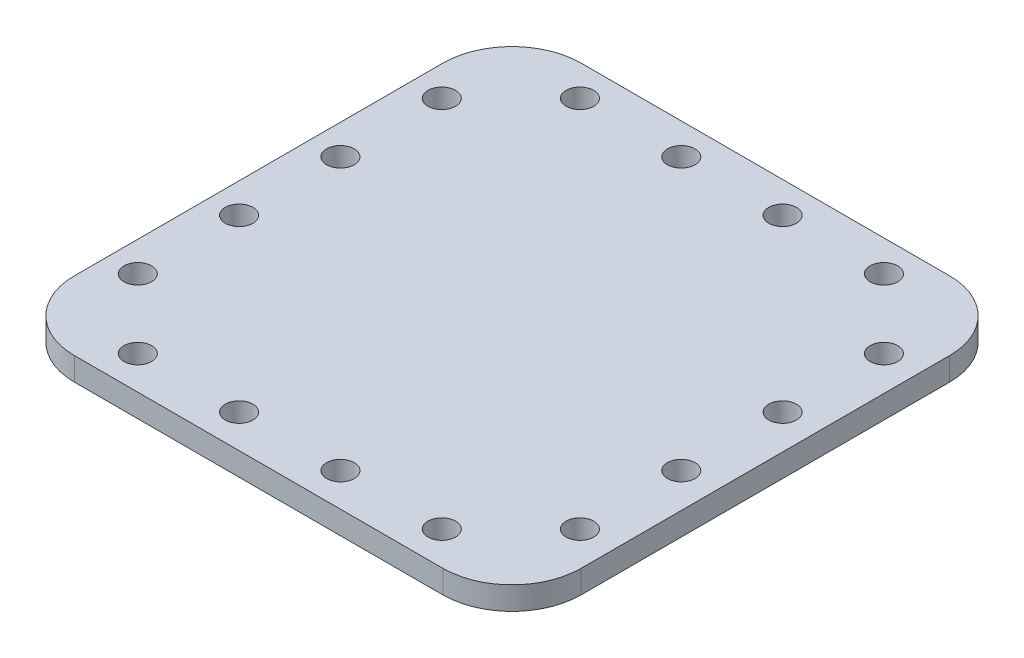
ISO-10303-21;
HEADER;
FILE_DESCRIPTION(('STEP AP214'),'2;1');
FILE_NAME('part.step','',(''),(''),'','','');
FILE_SCHEMA(('AUTOMOTIVE_DESIGN { 1 0 10303 214 1 1 1 1 }'));
ENDSEC;
DATA;
#1=APPLICATION_CONTEXT('core data for automotive mechanical design processes');
#2=APPLICATION_PROTOCOL_DEFINITION('international standard','automotive_design',2000,#1);
#3=PRODUCT_CONTEXT('',#1,'mechanical');
#4=PRODUCT('Part','Part','',(#3));
#5=PRODUCT_RELATED_PRODUCT_CATEGORY('part','',(#4));
#6=PRODUCT_DEFINITION_FORMATION('','',#4);
#7=PRODUCT_DEFINITION_CONTEXT('part definition',#1,'design');
#8=PRODUCT_DEFINITION('design','',#6,#7);
#9=PRODUCT_DEFINITION_SHAPE('','',#8);
#10=(LENGTH_UNIT() NAMED_UNIT(*) SI_UNIT(.MILLI.,.METRE.));
#11=(NAMED_UNIT(*) PLANE_ANGLE_UNIT() SI_UNIT($,.RADIAN.));
#12=(NAMED_UNIT(*) SI_UNIT($,.STERADIAN.) SOLID_ANGLE_UNIT());
#13=UNCERTAINTY_MEASURE_WITH_UNIT(LENGTH_MEASURE(1.E-05),#10,'distance_accuracy_value','');
#14=(GEOMETRIC_REPRESENTATION_CONTEXT(3) GLOBAL_UNCERTAINTY_ASSIGNED_CONTEXT((#13)) GLOBAL_UNIT_ASSIGNED_CONTEXT((#10,
#11,#12)) REPRESENTATION_CONTEXT('',''));
#15=CARTESIAN_POINT('',(0.,0.,0.));
#16=DIRECTION('',(0.,0.,1.));
#17=DIRECTION('',(1.,0.,0.));
#18=AXIS2_PLACEMENT_3D('',#15,#16,#17);
#19=CARTESIAN_POINT('',(40.,5.,55.));
#20=DIRECTION('',(0.,1.,0.));
#21=DIRECTION('',(0.,0.,1.));
#22=AXIS2_PLACEMENT_3D('',#19,#20,#21);
#23=PLANE('',#22);
#24=CARTESIAN_POINT('',(-48.5020444583901,5.,32.748977770805));
#25=DIRECTION('',(0.,-1.,0.));
#26=DIRECTION('',(0.,0.,-1.));
#27=AXIS2_PLACEMENT_3D('',#24,#25,#26);
#28=CIRCLE('',#27,3.);
#29=CARTESIAN_POINT('',(-48.5020444583901,5.,29.7489777708049));
#30=VERTEX_POINT('',#29);
#31=EDGE_CURVE('E133',#30,#30,#28,.T.);
#32=ORIENTED_EDGE('',*,*,#31,.T.);
#33=EDGE_LOOP('',(#32));
#34=FACE_BOUND('',#33,.T.);
#35=CARTESIAN_POINT('',(-11.5020444583901,5.,-48.2510222291951));
#36=DIRECTION('',(0.,-1.,0.));
#37=DIRECTION('',(0.,0.,-1.));
#38=AXIS2_PLACEMENT_3D('',#35,#36,#37);
#39=CIRCLE('',#38,3.00000000000002);
#40=CARTESIAN_POINT('',(-11.5020444583901,5.,-51.2510222291951));
#41=VERTEX_POINT('',#40);
#42=EDGE_CURVE('E136',#41,#41,#39,.T.);
#43=ORIENTED_EDGE('',*,*,#42,.T.);
#44=EDGE_LOOP('',(#43));
#45=FACE_BOUND('',#44,.T.);
#46=CARTESIAN_POINT('',(10.4979555416099,5.,-48.2510222291951));
#47=DIRECTION('',(0.,-1.,0.));
#48=DIRECTION('',(0.,0.,-1.));
#49=AXIS2_PLACEMENT_3D('',#46,#47,#48);
#50=CIRCLE('',#49,2.99999999999997);
#51=CARTESIAN_POINT('',(10.4979555416099,5.,-51.251022229195));
#52=VERTEX_POINT('',#51);
#53=EDGE_CURVE('E139',#52,#52,#50,.T.);
#54=ORIENTED_EDGE('',*,*,#53,.T.);
#55=EDGE_LOOP('',(#54));
#56=FACE_BOUND('',#55,.T.);
#57=CARTESIAN_POINT('',(47.4979555416099,5.,-11.251022229195));
#58=DIRECTION('',(0.,-1.,0.));
#59=DIRECTION('',(0.,0.,-1.));
#60=AXIS2_PLACEMENT_3D('',#57,#58,#59);
#61=CIRCLE('',#60,3.00000000000002);
#62=CARTESIAN_POINT('',(47.4979555416099,5.,-14.2510222291951));
#63=VERTEX_POINT('',#62);
#64=EDGE_CURVE('E142',#63,#63,#61,.T.);
#65=ORIENTED_EDGE('',*,*,#64,.T.);
#66=EDGE_LOOP('',(#65));
#67=FACE_BOUND('',#66,.T.);
#68=CARTESIAN_POINT('',(47.4979555416099,5.,32.748977770805));
#69=DIRECTION('',(0.,-1.,0.));
#70=DIRECTION('',(0.,0.,-1.));
#71=AXIS2_PLACEMENT_3D('',#68,#69,#70);
#72=CIRCLE('',#71,3.00000000000001);
#73=CARTESIAN_POINT('',(47.4979555416099,5.,29.7489777708049));
#74=VERTEX_POINT('',#73);
#75=EDGE_CURVE('E145',#74,#74,#72,.T.);
#76=ORIENTED_EDGE('',*,*,#75,.T.);
#77=EDGE_LOOP('',(#76));
#78=FACE_BOUND('',#77,.T.);
#79=CARTESIAN_POINT('',(-48.5020444583901,5.,10.7489777708049));
#80=DIRECTION('',(0.,-1.,0.));
#81=DIRECTION('',(0.,0.,-1.));
#82=AXIS2_PLACEMENT_3D('',#79,#80,#81);
#83=CIRCLE('',#82,2.99999999999997);
#84=CARTESIAN_POINT('',(-48.5020444583901,5.,7.74897777080498));
#85=VERTEX_POINT('',#84);
#86=EDGE_CURVE('E148',#85,#85,#83,.T.);
#87=ORIENTED_EDGE('',*,*,#86,.T.);
#88=EDGE_LOOP('',(#87));
#89=FACE_BOUND('',#88,.T.);
#90=CARTESIAN_POINT('',(-48.5020444583901,5.,-11.2510222291951));
#91=DIRECTION('',(0.,-1.,0.));
#92=DIRECTION('',(0.,0.,-1.));
#93=AXIS2_PLACEMENT_3D('',#90,#91,#92);
#94=CIRCLE('',#93,3.00000000000003);
#95=CARTESIAN_POINT('',(-48.5020444583901,5.,-14.2510222291951));
#96=VERTEX_POINT('',#95);
#97=EDGE_CURVE('E151',#96,#96,#94,.T.);
#98=ORIENTED_EDGE('',*,*,#97,.T.);
#99=EDGE_LOOP('',(#98));
#100=FACE_BOUND('',#99,.T.);
#101=CARTESIAN_POINT('',(-48.5020444583901,5.,-33.2510222291951));
#102=DIRECTION('',(0.,-1.,0.));
#103=DIRECTION('',(0.,0.,-1.));
#104=AXIS2_PLACEMENT_3D('',#101,#102,#103);
#105=CIRCLE('',#104,3.);
#106=CARTESIAN_POINT('',(-48.5020444583901,5.,-36.2510222291951));
#107=VERTEX_POINT('',#106);
#108=EDGE_CURVE('E154',#107,#107,#105,.T.);
#109=ORIENTED_EDGE('',*,*,#108,.T.);
#110=EDGE_LOOP('',(#109));
#111=FACE_BOUND('',#110,.T.);
#112=CARTESIAN_POINT('',(-33.5020444583901,5.,47.748977770805));
#113=DIRECTION('',(0.,-1.,0.));
#114=DIRECTION('',(0.,0.,-1.));
#115=AXIS2_PLACEMENT_3D('',#112,#113,#114);
#116=CIRCLE('',#115,3.00000000000001);
#117=CARTESIAN_POINT('',(-33.5020444583901,5.,44.7489777708049));
#118=VERTEX_POINT('',#117);
#119=EDGE_CURVE('E157',#118,#118,#116,.T.);
#120=ORIENTED_EDGE('',*,*,#119,.T.);
#121=EDGE_LOOP('',(#120));
#122=FACE_BOUND('',#121,.T.);
#123=CARTESIAN_POINT('',(-11.5020444583901,5.,47.7489777708049));
#124=DIRECTION('',(0.,-1.,0.));
#125=DIRECTION('',(0.,0.,-1.));
#126=AXIS2_PLACEMENT_3D('',#123,#124,#125);
#127=CIRCLE('',#126,3.00000000000002);
#128=CARTESIAN_POINT('',(-11.5020444583901,5.,44.7489777708049));
#129=VERTEX_POINT('',#128);
#130=EDGE_CURVE('E160',#129,#129,#127,.T.);
#131=ORIENTED_EDGE('',*,*,#130,.T.);
#132=EDGE_LOOP('',(#131));
#133=FACE_BOUND('',#132,.T.);
#134=CARTESIAN_POINT('',(10.4979555416099,5.,47.7489777708049));
#135=DIRECTION('',(0.,-1.,0.));
#136=DIRECTION('',(0.,0.,-1.));
#137=AXIS2_PLACEMENT_3D('',#134,#135,#136);
#138=CIRCLE('',#137,2.99999999999997);
#139=CARTESIAN_POINT('',(10.4979555416099,5.,44.748977770805));
#140=VERTEX_POINT('',#139);
#141=EDGE_CURVE('E163',#140,#140,#138,.T.);
#142=ORIENTED_EDGE('',*,*,#141,.T.);
#143=EDGE_LOOP('',(#142));
#144=FACE_BOUND('',#143,.T.);
#145=CARTESIAN_POINT('',(32.4979555416099,5.,47.7489777708049));
#146=DIRECTION('',(0.,-1.,0.));
#147=DIRECTION('',(0.,0.,-1.));
#148=AXIS2_PLACEMENT_3D('',#145,#146,#147);
#149=CIRCLE('',#148,3.00000000000001);
#150=CARTESIAN_POINT('',(32.4979555416099,5.,44.7489777708049));
#151=VERTEX_POINT('',#150);
#152=EDGE_CURVE('E166',#151,#151,#149,.T.);
#153=ORIENTED_EDGE('',*,*,#152,.T.);
#154=EDGE_LOOP('',(#153));
#155=FACE_BOUND('',#154,.T.);
#156=CARTESIAN_POINT('',(47.4979555416099,5.,10.7489777708049));
#157=DIRECTION('',(0.,-1.,0.));
#158=DIRECTION('',(0.,0.,-1.));
#159=AXIS2_PLACEMENT_3D('',#156,#157,#158);
#160=CIRCLE('',#159,2.99999999999997);
#161=CARTESIAN_POINT('',(47.4979555416099,5.,7.74897777080498));
#162=VERTEX_POINT('',#161);
#163=EDGE_CURVE('E169',#162,#162,#160,.T.);
#164=ORIENTED_EDGE('',*,*,#163,.T.);
#165=EDGE_LOOP('',(#164));
#166=FACE_BOUND('',#165,.T.);
#167=CARTESIAN_POINT('',(47.4979555416099,5.,-33.2510222291951));
#168=DIRECTION('',(0.,-1.,0.));
#169=DIRECTION('',(0.,0.,-1.));
#170=AXIS2_PLACEMENT_3D('',#167,#168,#169);
#171=CIRCLE('',#170,3.00000000000001);
#172=CARTESIAN_POINT('',(47.4979555416099,5.,-36.2510222291951));
#173=VERTEX_POINT('',#172);
#174=EDGE_CURVE('E172',#173,#173,#171,.T.);
#175=ORIENTED_EDGE('',*,*,#174,.T.);
#176=EDGE_LOOP('',(#175));
#177=FACE_BOUND('',#176,.T.);
#178=CARTESIAN_POINT('',(32.4979555416099,5.,-48.2510222291951));
#179=DIRECTION('',(0.,-1.,0.));
#180=DIRECTION('',(0.,0.,-1.));
#181=AXIS2_PLACEMENT_3D('',#178,#179,#180);
#182=CIRCLE('',#181,2.99999999999997);
#183=CARTESIAN_POINT('',(32.4979555416099,5.,-51.251022229195));
#184=VERTEX_POINT('',#183);
#185=EDGE_CURVE('E175',#184,#184,#182,.T.);
#186=ORIENTED_EDGE('',*,*,#185,.T.);
#187=EDGE_LOOP('',(#186));
#188=FACE_BOUND('',#187,.T.);
#189=CARTESIAN_POINT('',(-33.5020444583901,5.,-48.2510222291951));
#190=DIRECTION('',(0.,-1.,0.));
#191=DIRECTION('',(0.,0.,-1.));
#192=AXIS2_PLACEMENT_3D('',#189,#190,#191);
#193=CIRCLE('',#192,3.00000000000001);
#194=CARTESIAN_POINT('',(-33.5020444583901,5.,-51.2510222291951));
#195=VERTEX_POINT('',#194);
#196=EDGE_CURVE('E178',#195,#195,#193,.T.);
#197=ORIENTED_EDGE('',*,*,#196,.T.);
#198=EDGE_LOOP('',(#197));
#199=FACE_BOUND('',#198,.T.);
#200=DIRECTION('',(1.,0.,0.));
#201=VECTOR('',#200,1.);
#202=CARTESIAN_POINT('',(-55.,5.,55.));
#203=LINE('',#202,#201);
#204=CARTESIAN_POINT('',(-40.,5.,55.));
#205=VERTEX_POINT('',#204);
#206=CARTESIAN_POINT('',(40.,5.,55.));
#207=VERTEX_POINT('',#206);
#208=EDGE_CURVE('E109',#205,#207,#203,.T.);
#209=ORIENTED_EDGE('',*,*,#208,.T.);
#210=CARTESIAN_POINT('',(40.,5.,40.));
#211=DIRECTION('',(0.,-1.,0.));
#212=DIRECTION('',(0.,0.,-1.));
#213=AXIS2_PLACEMENT_3D('',#210,#211,#212);
#214=CIRCLE('',#213,15.);
#215=CARTESIAN_POINT('',(55.,5.,40.));
#216=VERTEX_POINT('',#215);
#217=EDGE_CURVE('E106',#207,#216,#214,.F.);
#218=ORIENTED_EDGE('',*,*,#217,.T.);
#219=DIRECTION('',(0.,0.,-1.));
#220=VECTOR('',#219,1.);
#221=CARTESIAN_POINT('',(55.,5.,55.));
#222=LINE('',#221,#220);
#223=CARTESIAN_POINT('',(55.,5.,-40.));
#224=VERTEX_POINT('',#223);
#225=EDGE_CURVE('E64',#216,#224,#222,.T.);
#226=ORIENTED_EDGE('',*,*,#225,.T.);
#227=CARTESIAN_POINT('',(40.,5.,-40.));
#228=DIRECTION('',(0.,-1.,0.));
#229=DIRECTION('',(0.,0.,-1.));
#230=AXIS2_PLACEMENT_3D('',#227,#228,#229);
#231=CIRCLE('',#230,15.);
#232=CARTESIAN_POINT('',(40.,5.,-55.));
#233=VERTEX_POINT('',#232);
#234=EDGE_CURVE('E286',#224,#233,#231,.F.);
#235=ORIENTED_EDGE('',*,*,#234,.T.);
#236=DIRECTION('',(-1.,0.,0.));
#237=VECTOR('',#236,1.);
#238=CARTESIAN_POINT('',(-55.,5.,-55.));
#239=LINE('',#238,#237);
#240=CARTESIAN_POINT('',(-40.,5.,-55.));
#241=VERTEX_POINT('',#240);
#242=EDGE_CURVE('E123',#233,#241,#239,.T.);
#243=ORIENTED_EDGE('',*,*,#242,.T.);
#244=CARTESIAN_POINT('',(-40.,5.,-40.));
#245=DIRECTION('',(0.,-1.,0.));
#246=DIRECTION('',(0.,0.,-1.));
#247=AXIS2_PLACEMENT_3D('',#244,#245,#246);
#248=CIRCLE('',#247,15.);
#249=CARTESIAN_POINT('',(-55.,5.,-40.));
#250=VERTEX_POINT('',#249);
#251=EDGE_CURVE('E260',#241,#250,#248,.F.);
#252=ORIENTED_EDGE('',*,*,#251,.T.);
#253=DIRECTION('',(0.,0.,1.));
#254=VECTOR('',#253,1.);
#255=CARTESIAN_POINT('',(-55.,5.,55.));
#256=LINE('',#255,#254);
#257=CARTESIAN_POINT('',(-55.,5.,40.));
#258=VERTEX_POINT('',#257);
#259=EDGE_CURVE('E129',#250,#258,#256,.T.);
#260=ORIENTED_EDGE('',*,*,#259,.T.);
#261=CARTESIAN_POINT('',(-40.,5.,40.));
#262=DIRECTION('',(0.,-1.,0.));
#263=DIRECTION('',(0.,0.,-1.));
#264=AXIS2_PLACEMENT_3D('',#261,#262,#263);
#265=CIRCLE('',#264,15.);
#266=EDGE_CURVE('E258',#258,#205,#265,.F.);
#267=ORIENTED_EDGE('',*,*,#266,.T.);
#268=EDGE_LOOP('',(#209,#218,#226,#235,#243,#252,#260,#267));
#269=FACE_BOUND('',#268,.T.);
#270=ADVANCED_FACE('F40',(#34,#45,#56,#67,#78,#89,#100,#111,#122,#133,#144,#155,#166,#177,#188,
#199,#269),#23,.T.);
#271=CARTESIAN_POINT('',(40.,5.,-40.));
#272=DIRECTION('',(0.,1.,0.));
#273=DIRECTION('',(0.,0.,1.));
#274=AXIS2_PLACEMENT_3D('',#271,#272,#273);
#275=CYLINDRICAL_SURFACE('',#274,15.);
#276=DIRECTION('',(0.,1.,0.));
#277=VECTOR('',#276,1.);
#278=CARTESIAN_POINT('',(55.,5.,-40.));
#279=LINE('',#278,#277);
#280=CARTESIAN_POINT('',(55.,0.,-40.));
#281=VERTEX_POINT('',#280);
#282=EDGE_CURVE('E121',#281,#224,#279,.T.);
#283=ORIENTED_EDGE('',*,*,#282,.F.);
#284=CARTESIAN_POINT('',(40.,0.,-40.));
#285=DIRECTION('',(0.,-1.,0.));
#286=DIRECTION('',(0.,0.,-1.));
#287=AXIS2_PLACEMENT_3D('',#284,#285,#286);
#288=CIRCLE('',#287,15.);
#289=CARTESIAN_POINT('',(40.,0.,-55.));
#290=VERTEX_POINT('',#289);
#291=EDGE_CURVE('E249',#290,#281,#288,.T.);
#292=ORIENTED_EDGE('',*,*,#291,.F.);
#293=DIRECTION('',(0.,1.,0.));
#294=VECTOR('',#293,1.);
#295=CARTESIAN_POINT('',(40.,5.,-55.));
#296=LINE('',#295,#294);
#297=EDGE_CURVE('E289',#233,#290,#296,.F.);
#298=ORIENTED_EDGE('',*,*,#297,.F.);
#299=ORIENTED_EDGE('',*,*,#234,.F.);
#300=EDGE_LOOP('',(#283,#292,#298,#299));
#301=FACE_BOUND('',#300,.T.);
#302=ADVANCED_FACE('F300',(#301),#275,.T.);
#303=CARTESIAN_POINT('',(-40.,5.,-40.));
#304=DIRECTION('',(0.,1.,0.));
#305=DIRECTION('',(0.,0.,1.));
#306=AXIS2_PLACEMENT_3D('',#303,#304,#305);
#307=CYLINDRICAL_SURFACE('',#306,15.);
#308=DIRECTION('',(0.,1.,0.));
#309=VECTOR('',#308,1.);
#310=CARTESIAN_POINT('',(-40.,5.,-55.));
#311=LINE('',#310,#309);
#312=CARTESIAN_POINT('',(-40.,0.,-55.));
#313=VERTEX_POINT('',#312);
#314=EDGE_CURVE('E283',#313,#241,#311,.T.);
#315=ORIENTED_EDGE('',*,*,#314,.F.);
#316=CARTESIAN_POINT('',(-40.,0.,-40.));
#317=DIRECTION('',(0.,-1.,0.));
#318=DIRECTION('',(0.,0.,-1.));
#319=AXIS2_PLACEMENT_3D('',#316,#317,#318);
#320=CIRCLE('',#319,15.);
#321=CARTESIAN_POINT('',(-55.,0.,-40.));
#322=VERTEX_POINT('',#321);
#323=EDGE_CURVE('E274',#322,#313,#320,.T.);
#324=ORIENTED_EDGE('',*,*,#323,.F.);
#325=DIRECTION('',(0.,1.,0.));
#326=VECTOR('',#325,1.);
#327=CARTESIAN_POINT('',(-55.,5.,-40.));
#328=LINE('',#327,#326);
#329=EDGE_CURVE('E267',#250,#322,#328,.F.);
#330=ORIENTED_EDGE('',*,*,#329,.F.);
#331=ORIENTED_EDGE('',*,*,#251,.F.);
#332=EDGE_LOOP('',(#315,#324,#330,#331));
#333=FACE_BOUND('',#332,.T.);
#334=ADVANCED_FACE('F299',(#333),#307,.T.);
#335=CARTESIAN_POINT('',(-40.,5.,40.));
#336=DIRECTION('',(0.,1.,0.));
#337=DIRECTION('',(0.,0.,1.));
#338=AXIS2_PLACEMENT_3D('',#335,#336,#337);
#339=CYLINDRICAL_SURFACE('',#338,15.);
#340=DIRECTION('',(0.,1.,0.));
#341=VECTOR('',#340,1.);
#342=CARTESIAN_POINT('',(-55.,5.,40.));
#343=LINE('',#342,#341);
#344=CARTESIAN_POINT('',(-55.,0.,40.));
#345=VERTEX_POINT('',#344);
#346=EDGE_CURVE('E270',#345,#258,#343,.T.);
#347=ORIENTED_EDGE('',*,*,#346,.F.);
#348=CARTESIAN_POINT('',(-40.,0.,40.));
#349=DIRECTION('',(0.,-1.,0.));
#350=DIRECTION('',(0.,0.,-1.));
#351=AXIS2_PLACEMENT_3D('',#348,#349,#350);
#352=CIRCLE('',#351,15.);
#353=CARTESIAN_POINT('',(-40.,0.,55.));
#354=VERTEX_POINT('',#353);
#355=EDGE_CURVE('E277',#354,#345,#352,.T.);
#356=ORIENTED_EDGE('',*,*,#355,.F.);
#357=DIRECTION('',(0.,1.,0.));
#358=VECTOR('',#357,1.);
#359=CARTESIAN_POINT('',(-40.,5.,55.));
#360=LINE('',#359,#358);
#361=EDGE_CURVE('E272',#205,#354,#360,.F.);
#362=ORIENTED_EDGE('',*,*,#361,.F.);
#363=ORIENTED_EDGE('',*,*,#266,.F.);
#364=EDGE_LOOP('',(#347,#356,#362,#363));
#365=FACE_BOUND('',#364,.T.);
#366=ADVANCED_FACE('F307',(#365),#339,.T.);
#367=CARTESIAN_POINT('',(40.,5.,40.));
#368=DIRECTION('',(0.,1.,0.));
#369=DIRECTION('',(0.,0.,1.));
#370=AXIS2_PLACEMENT_3D('',#367,#368,#369);
#371=CYLINDRICAL_SURFACE('',#370,15.);
#372=DIRECTION('',(0.,1.,0.));
#373=VECTOR('',#372,1.);
#374=CARTESIAN_POINT('',(40.,5.,55.));
#375=LINE('',#374,#373);
#376=CARTESIAN_POINT('',(40.,0.,55.));
#377=VERTEX_POINT('',#376);
#378=EDGE_CURVE('E117',#377,#207,#375,.T.);
#379=ORIENTED_EDGE('',*,*,#378,.F.);
#380=CARTESIAN_POINT('',(40.,0.,40.));
#381=DIRECTION('',(0.,-1.,0.));
#382=DIRECTION('',(0.,0.,-1.));
#383=AXIS2_PLACEMENT_3D('',#380,#381,#382);
#384=CIRCLE('',#383,15.);
#385=CARTESIAN_POINT('',(55.,0.,40.));
#386=VERTEX_POINT('',#385);
#387=EDGE_CURVE('E113',#386,#377,#384,.T.);
#388=ORIENTED_EDGE('',*,*,#387,.F.);
#389=DIRECTION('',(0.,1.,0.));
#390=VECTOR('',#389,1.);
#391=CARTESIAN_POINT('',(55.,5.,40.));
#392=LINE('',#391,#390);
#393=EDGE_CURVE('E115',#216,#386,#392,.F.);
#394=ORIENTED_EDGE('',*,*,#393,.F.);
#395=ORIENTED_EDGE('',*,*,#217,.F.);
#396=EDGE_LOOP('',(#379,#388,#394,#395));
#397=FACE_BOUND('',#396,.T.);
#398=ADVANCED_FACE('F116',(#397),#371,.T.);
#399=CARTESIAN_POINT('',(0.,0.,0.));
#400=DIRECTION('',(0.,-1.,0.));
#401=DIRECTION('',(0.,0.,-1.));
#402=AXIS2_PLACEMENT_3D('',#399,#400,#401);
#403=PLANE('',#402);
#404=CARTESIAN_POINT('',(-48.5020444583901,0.,32.748977770805));
#405=DIRECTION('',(0.,-1.,0.));
#406=DIRECTION('',(0.,0.,-1.));
#407=AXIS2_PLACEMENT_3D('',#404,#405,#406);
#408=CIRCLE('',#407,3.);
#409=CARTESIAN_POINT('',(-48.5020444583901,0.,29.7489777708049));
#410=VERTEX_POINT('',#409);
#411=EDGE_CURVE('E197',#410,#410,#408,.T.);
#412=ORIENTED_EDGE('',*,*,#411,.F.);
#413=EDGE_LOOP('',(#412));
#414=FACE_BOUND('',#413,.T.);
#415=CARTESIAN_POINT('',(-11.5020444583901,0.,-48.2510222291951));
#416=DIRECTION('',(0.,-1.,0.));
#417=DIRECTION('',(0.,0.,-1.));
#418=AXIS2_PLACEMENT_3D('',#415,#416,#417);
#419=CIRCLE('',#418,3.00000000000002);
#420=CARTESIAN_POINT('',(-11.5020444583901,0.,-51.2510222291951));
#421=VERTEX_POINT('',#420);
#422=EDGE_CURVE('E200',#421,#421,#419,.T.);
#423=ORIENTED_EDGE('',*,*,#422,.F.);
#424=EDGE_LOOP('',(#423));
#425=FACE_BOUND('',#424,.T.);
#426=CARTESIAN_POINT('',(10.4979555416099,0.,-48.2510222291951));
#427=DIRECTION('',(0.,-1.,0.));
#428=DIRECTION('',(0.,0.,-1.));
#429=AXIS2_PLACEMENT_3D('',#426,#427,#428);
#430=CIRCLE('',#429,2.99999999999997);
#431=CARTESIAN_POINT('',(10.4979555416099,0.,-51.251022229195));
#432=VERTEX_POINT('',#431);
#433=EDGE_CURVE('E203',#432,#432,#430,.T.);
#434=ORIENTED_EDGE('',*,*,#433,.F.);
#435=EDGE_LOOP('',(#434));
#436=FACE_BOUND('',#435,.T.);
#437=CARTESIAN_POINT('',(47.4979555416099,0.,-11.251022229195));
#438=DIRECTION('',(0.,-1.,0.));
#439=DIRECTION('',(0.,0.,-1.));
#440=AXIS2_PLACEMENT_3D('',#437,#438,#439);
#441=CIRCLE('',#440,3.00000000000002);
#442=CARTESIAN_POINT('',(47.4979555416099,0.,-14.2510222291951));
#443=VERTEX_POINT('',#442);
#444=EDGE_CURVE('E188',#443,#443,#441,.T.);
#445=ORIENTED_EDGE('',*,*,#444,.F.);
#446=EDGE_LOOP('',(#445));
#447=FACE_BOUND('',#446,.T.);
#448=CARTESIAN_POINT('',(47.4979555416099,0.,32.748977770805));
#449=DIRECTION('',(0.,-1.,0.));
#450=DIRECTION('',(0.,0.,-1.));
#451=AXIS2_PLACEMENT_3D('',#448,#449,#450);
#452=CIRCLE('',#451,3.00000000000001);
#453=CARTESIAN_POINT('',(47.4979555416099,0.,29.7489777708049));
#454=VERTEX_POINT('',#453);
#455=EDGE_CURVE('E185',#454,#454,#452,.T.);
#456=ORIENTED_EDGE('',*,*,#455,.F.);
#457=EDGE_LOOP('',(#456));
#458=FACE_BOUND('',#457,.T.);
#459=CARTESIAN_POINT('',(-48.5020444583901,0.,10.7489777708049));
#460=DIRECTION('',(0.,-1.,0.));
#461=DIRECTION('',(0.,0.,-1.));
#462=AXIS2_PLACEMENT_3D('',#459,#460,#461);
#463=CIRCLE('',#462,2.99999999999997);
#464=CARTESIAN_POINT('',(-48.5020444583901,0.,7.74897777080498));
#465=VERTEX_POINT('',#464);
#466=EDGE_CURVE('E189',#465,#465,#463,.T.);
#467=ORIENTED_EDGE('',*,*,#466,.F.);
#468=EDGE_LOOP('',(#467));
#469=FACE_BOUND('',#468,.T.);
#470=CARTESIAN_POINT('',(-48.5020444583901,0.,-11.2510222291951));
#471=DIRECTION('',(0.,-1.,0.));
#472=DIRECTION('',(0.,0.,-1.));
#473=AXIS2_PLACEMENT_3D('',#470,#471,#472);
#474=CIRCLE('',#473,3.00000000000003);
#475=CARTESIAN_POINT('',(-48.5020444583901,0.,-14.2510222291951));
#476=VERTEX_POINT('',#475);
#477=EDGE_CURVE('E192',#476,#476,#474,.T.);
#478=ORIENTED_EDGE('',*,*,#477,.F.);
#479=EDGE_LOOP('',(#478));
#480=FACE_BOUND('',#479,.T.);
#481=CARTESIAN_POINT('',(-48.5020444583901,0.,-33.2510222291951));
#482=DIRECTION('',(0.,-1.,0.));
#483=DIRECTION('',(0.,0.,-1.));
#484=AXIS2_PLACEMENT_3D('',#481,#482,#483);
#485=CIRCLE('',#484,3.);
#486=CARTESIAN_POINT('',(-48.5020444583901,0.,-36.2510222291951));
#487=VERTEX_POINT('',#486);
#488=EDGE_CURVE('E184',#487,#487,#485,.T.);
#489=ORIENTED_EDGE('',*,*,#488,.F.);
#490=EDGE_LOOP('',(#489));
#491=FACE_BOUND('',#490,.T.);
#492=CARTESIAN_POINT('',(-33.5020444583901,0.,47.748977770805));
#493=DIRECTION('',(0.,-1.,0.));
#494=DIRECTION('',(0.,0.,-1.));
#495=AXIS2_PLACEMENT_3D('',#492,#493,#494);
#496=CIRCLE('',#495,3.00000000000001);
#497=CARTESIAN_POINT('',(-33.5020444583901,0.,44.7489777708049));
#498=VERTEX_POINT('',#497);
#499=EDGE_CURVE('E43',#498,#498,#496,.T.);
#500=ORIENTED_EDGE('',*,*,#499,.F.);
#501=EDGE_LOOP('',(#500));
#502=FACE_BOUND('',#501,.T.);
#503=CARTESIAN_POINT('',(-11.5020444583901,0.,47.7489777708049));
#504=DIRECTION('',(0.,-1.,0.));
#505=DIRECTION('',(0.,0.,-1.));
#506=AXIS2_PLACEMENT_3D('',#503,#504,#505);
#507=CIRCLE('',#506,3.00000000000002);
#508=CARTESIAN_POINT('',(-11.5020444583901,0.,44.7489777708049));
#509=VERTEX_POINT('',#508);
#510=EDGE_CURVE('E218',#509,#509,#507,.T.);
#511=ORIENTED_EDGE('',*,*,#510,.F.);
#512=EDGE_LOOP('',(#511));
#513=FACE_BOUND('',#512,.T.);
#514=CARTESIAN_POINT('',(10.4979555416099,0.,47.7489777708049));
#515=DIRECTION('',(0.,-1.,0.));
#516=DIRECTION('',(0.,0.,-1.));
#517=AXIS2_PLACEMENT_3D('',#514,#515,#516);
#518=CIRCLE('',#517,2.99999999999997);
#519=CARTESIAN_POINT('',(10.4979555416099,0.,44.748977770805));
#520=VERTEX_POINT('',#519);
#521=EDGE_CURVE('E216',#520,#520,#518,.T.);
#522=ORIENTED_EDGE('',*,*,#521,.F.);
#523=EDGE_LOOP('',(#522));
#524=FACE_BOUND('',#523,.T.);
#525=CARTESIAN_POINT('',(32.4979555416099,0.,47.7489777708049));
#526=DIRECTION('',(0.,-1.,0.));
#527=DIRECTION('',(0.,0.,-1.));
#528=AXIS2_PLACEMENT_3D('',#525,#526,#527);
#529=CIRCLE('',#528,3.00000000000001);
#530=CARTESIAN_POINT('',(32.4979555416099,0.,44.7489777708049));
#531=VERTEX_POINT('',#530);
#532=EDGE_CURVE('E213',#531,#531,#529,.T.);
#533=ORIENTED_EDGE('',*,*,#532,.F.);
#534=EDGE_LOOP('',(#533));
#535=FACE_BOUND('',#534,.T.);
#536=CARTESIAN_POINT('',(47.4979555416099,0.,10.7489777708049));
#537=DIRECTION('',(0.,-1.,0.));
#538=DIRECTION('',(0.,0.,-1.));
#539=AXIS2_PLACEMENT_3D('',#536,#537,#538);
#540=CIRCLE('',#539,2.99999999999997);
#541=CARTESIAN_POINT('',(47.4979555416099,0.,7.74897777080498));
#542=VERTEX_POINT('',#541);
#543=EDGE_CURVE('E210',#542,#542,#540,.T.);
#544=ORIENTED_EDGE('',*,*,#543,.F.);
#545=EDGE_LOOP('',(#544));
#546=FACE_BOUND('',#545,.T.);
#547=CARTESIAN_POINT('',(47.4979555416099,0.,-33.2510222291951));
#548=DIRECTION('',(0.,-1.,0.));
#549=DIRECTION('',(0.,0.,-1.));
#550=AXIS2_PLACEMENT_3D('',#547,#548,#549);
#551=CIRCLE('',#550,3.00000000000001);
#552=CARTESIAN_POINT('',(47.4979555416099,0.,-36.2510222291951));
#553=VERTEX_POINT('',#552);
#554=EDGE_CURVE('E48',#553,#553,#551,.T.);
#555=ORIENTED_EDGE('',*,*,#554,.F.);
#556=EDGE_LOOP('',(#555));
#557=FACE_BOUND('',#556,.T.);
#558=CARTESIAN_POINT('',(32.4979555416099,0.,-48.2510222291951));
#559=DIRECTION('',(0.,-1.,0.));
#560=DIRECTION('',(0.,0.,-1.));
#561=AXIS2_PLACEMENT_3D('',#558,#559,#560);
#562=CIRCLE('',#561,2.99999999999997);
#563=CARTESIAN_POINT('',(32.4979555416099,0.,-51.251022229195));
#564=VERTEX_POINT('',#563);
#565=EDGE_CURVE('E11',#564,#564,#562,.T.);
#566=ORIENTED_EDGE('',*,*,#565,.F.);
#567=EDGE_LOOP('',(#566));
#568=FACE_BOUND('',#567,.T.);
#569=CARTESIAN_POINT('',(-33.5020444583901,0.,-48.2510222291951));
#570=DIRECTION('',(0.,-1.,0.));
#571=DIRECTION('',(0.,0.,-1.));
#572=AXIS2_PLACEMENT_3D('',#569,#570,#571);
#573=CIRCLE('',#572,3.00000000000001);
#574=CARTESIAN_POINT('',(-33.5020444583901,0.,-51.2510222291951));
#575=VERTEX_POINT('',#574);
#576=EDGE_CURVE('E181',#575,#575,#573,.T.);
#577=ORIENTED_EDGE('',*,*,#576,.F.);
#578=EDGE_LOOP('',(#577));
#579=FACE_BOUND('',#578,.T.);
#580=DIRECTION('',(0.,0.,-1.));
#581=VECTOR('',#580,1.);
#582=CARTESIAN_POINT('',(55.,0.,55.));
#583=LINE('',#582,#581);
#584=EDGE_CURVE('E56',#386,#281,#583,.T.);
#585=ORIENTED_EDGE('',*,*,#584,.F.);
#586=ORIENTED_EDGE('',*,*,#387,.T.);
#587=DIRECTION('',(1.,0.,0.));
#588=VECTOR('',#587,1.);
#589=CARTESIAN_POINT('',(-55.,0.,55.));
#590=LINE('',#589,#588);
#591=EDGE_CURVE('E122',#354,#377,#590,.T.);
#592=ORIENTED_EDGE('',*,*,#591,.F.);
#593=ORIENTED_EDGE('',*,*,#355,.T.);
#594=DIRECTION('',(0.,0.,1.));
#595=VECTOR('',#594,1.);
#596=CARTESIAN_POINT('',(-55.,0.,55.));
#597=LINE('',#596,#595);
#598=EDGE_CURVE('E126',#322,#345,#597,.T.);
#599=ORIENTED_EDGE('',*,*,#598,.F.);
#600=ORIENTED_EDGE('',*,*,#323,.T.);
#601=DIRECTION('',(-1.,0.,0.));
#602=VECTOR('',#601,1.);
#603=CARTESIAN_POINT('',(-55.,0.,-55.));
#604=LINE('',#603,#602);
#605=EDGE_CURVE('E250',#290,#313,#604,.T.);
#606=ORIENTED_EDGE('',*,*,#605,.F.);
#607=ORIENTED_EDGE('',*,*,#291,.T.);
#608=EDGE_LOOP('',(#585,#586,#592,#593,#599,#600,#606,#607));
#609=FACE_BOUND('',#608,.T.);
#610=ADVANCED_FACE('F228',(#414,#425,#436,#447,#458,#469,#480,#491,#502,#513,#524,#535,#546,
#557,#568,#579,#609),#403,.T.);
#611=CARTESIAN_POINT('',(-48.5020444583901,10.,32.748977770805));
#612=DIRECTION('',(0.,-1.,0.));
#613=DIRECTION('',(0.,0.,-1.));
#614=AXIS2_PLACEMENT_3D('',#611,#612,#613);
#615=CYLINDRICAL_SURFACE('',#614,3.);
#616=ORIENTED_EDGE('',*,*,#411,.T.);
#617=EDGE_LOOP('',(#616));
#618=FACE_BOUND('',#617,.T.);
#619=ORIENTED_EDGE('',*,*,#31,.F.);
#620=EDGE_LOOP('',(#619));
#621=FACE_BOUND('',#620,.T.);
#622=ADVANCED_FACE('F231',(#618,#621),#615,.F.);
#623=CARTESIAN_POINT('',(-11.5020444583901,10.,-48.2510222291951));
#624=DIRECTION('',(0.,-1.,0.));
#625=DIRECTION('',(0.,0.,-1.));
#626=AXIS2_PLACEMENT_3D('',#623,#624,#625);
#627=CYLINDRICAL_SURFACE('',#626,3.00000000000002);
#628=ORIENTED_EDGE('',*,*,#422,.T.);
#629=EDGE_LOOP('',(#628));
#630=FACE_BOUND('',#629,.T.);
#631=ORIENTED_EDGE('',*,*,#42,.F.);
#632=EDGE_LOOP('',(#631));
#633=FACE_BOUND('',#632,.T.);
#634=ADVANCED_FACE('F346',(#630,#633),#627,.F.);
#635=CARTESIAN_POINT('',(10.4979555416099,10.,-48.2510222291951));
#636=DIRECTION('',(0.,-1.,0.));
#637=DIRECTION('',(0.,0.,-1.));
#638=AXIS2_PLACEMENT_3D('',#635,#636,#637);
#639=CYLINDRICAL_SURFACE('',#638,2.99999999999997);
#640=ORIENTED_EDGE('',*,*,#433,.T.);
#641=EDGE_LOOP('',(#640));
#642=FACE_BOUND('',#641,.T.);
#643=ORIENTED_EDGE('',*,*,#53,.F.);
#644=EDGE_LOOP('',(#643));
#645=FACE_BOUND('',#644,.T.);
#646=ADVANCED_FACE('F350',(#642,#645),#639,.F.);
#647=CARTESIAN_POINT('',(47.4979555416099,10.,-11.251022229195));
#648=DIRECTION('',(0.,-1.,0.));
#649=DIRECTION('',(0.,0.,-1.));
#650=AXIS2_PLACEMENT_3D('',#647,#648,#649);
#651=CYLINDRICAL_SURFACE('',#650,3.00000000000002);
#652=ORIENTED_EDGE('',*,*,#444,.T.);
#653=EDGE_LOOP('',(#652));
#654=FACE_BOUND('',#653,.T.);
#655=ORIENTED_EDGE('',*,*,#64,.F.);
#656=EDGE_LOOP('',(#655));
#657=FACE_BOUND('',#656,.T.);
#658=ADVANCED_FACE('F331',(#654,#657),#651,.F.);
#659=CARTESIAN_POINT('',(47.4979555416099,10.,32.748977770805));
#660=DIRECTION('',(0.,-1.,0.));
#661=DIRECTION('',(0.,0.,-1.));
#662=AXIS2_PLACEMENT_3D('',#659,#660,#661);
#663=CYLINDRICAL_SURFACE('',#662,3.00000000000001);
#664=ORIENTED_EDGE('',*,*,#455,.T.);
#665=EDGE_LOOP('',(#664));
#666=FACE_BOUND('',#665,.T.);
#667=ORIENTED_EDGE('',*,*,#75,.F.);
#668=EDGE_LOOP('',(#667));
#669=FACE_BOUND('',#668,.T.);
#670=ADVANCED_FACE('F327',(#666,#669),#663,.F.);
#671=CARTESIAN_POINT('',(-48.5020444583901,10.,10.7489777708049));
#672=DIRECTION('',(0.,-1.,0.));
#673=DIRECTION('',(0.,0.,-1.));
#674=AXIS2_PLACEMENT_3D('',#671,#672,#673);
#675=CYLINDRICAL_SURFACE('',#674,2.99999999999997);
#676=ORIENTED_EDGE('',*,*,#466,.T.);
#677=EDGE_LOOP('',(#676));
#678=FACE_BOUND('',#677,.T.);
#679=ORIENTED_EDGE('',*,*,#86,.F.);
#680=EDGE_LOOP('',(#679));
#681=FACE_BOUND('',#680,.T.);
#682=ADVANCED_FACE('F330',(#678,#681),#675,.F.);
#683=CARTESIAN_POINT('',(-48.5020444583901,10.,-11.2510222291951));
#684=DIRECTION('',(0.,-1.,0.));
#685=DIRECTION('',(0.,0.,-1.));
#686=AXIS2_PLACEMENT_3D('',#683,#684,#685);
#687=CYLINDRICAL_SURFACE('',#686,3.00000000000003);
#688=ORIENTED_EDGE('',*,*,#477,.T.);
#689=EDGE_LOOP('',(#688));
#690=FACE_BOUND('',#689,.T.);
#691=ORIENTED_EDGE('',*,*,#97,.F.);
#692=EDGE_LOOP('',(#691));
#693=FACE_BOUND('',#692,.T.);
#694=ADVANCED_FACE('F335',(#690,#693),#687,.F.);
#695=CARTESIAN_POINT('',(-48.5020444583901,10.,-33.2510222291951));
#696=DIRECTION('',(0.,-1.,0.));
#697=DIRECTION('',(0.,0.,-1.));
#698=AXIS2_PLACEMENT_3D('',#695,#696,#697);
#699=CYLINDRICAL_SURFACE('',#698,3.);
#700=ORIENTED_EDGE('',*,*,#488,.T.);
#701=EDGE_LOOP('',(#700));
#702=FACE_BOUND('',#701,.T.);
#703=ORIENTED_EDGE('',*,*,#108,.F.);
#704=EDGE_LOOP('',(#703));
#705=FACE_BOUND('',#704,.T.);
#706=ADVANCED_FACE('F339',(#702,#705),#699,.F.);
#707=CARTESIAN_POINT('',(-33.5020444583901,10.,47.748977770805));
#708=DIRECTION('',(0.,-1.,0.));
#709=DIRECTION('',(0.,0.,-1.));
#710=AXIS2_PLACEMENT_3D('',#707,#708,#709);
#711=CYLINDRICAL_SURFACE('',#710,3.00000000000001);
#712=ORIENTED_EDGE('',*,*,#499,.T.);
#713=EDGE_LOOP('',(#712));
#714=FACE_BOUND('',#713,.T.);
#715=ORIENTED_EDGE('',*,*,#119,.F.);
#716=EDGE_LOOP('',(#715));
#717=FACE_BOUND('',#716,.T.);
#718=ADVANCED_FACE('F225',(#714,#717),#711,.F.);
#719=CARTESIAN_POINT('',(-11.5020444583901,10.,47.7489777708049));
#720=DIRECTION('',(0.,-1.,0.));
#721=DIRECTION('',(0.,0.,-1.));
#722=AXIS2_PLACEMENT_3D('',#719,#720,#721);
#723=CYLINDRICAL_SURFACE('',#722,3.00000000000002);
#724=ORIENTED_EDGE('',*,*,#510,.T.);
#725=EDGE_LOOP('',(#724));
#726=FACE_BOUND('',#725,.T.);
#727=ORIENTED_EDGE('',*,*,#130,.F.);
#728=EDGE_LOOP('',(#727));
#729=FACE_BOUND('',#728,.T.);
#730=ADVANCED_FACE('F376',(#726,#729),#723,.F.);
#731=CARTESIAN_POINT('',(10.4979555416099,10.,47.7489777708049));
#732=DIRECTION('',(0.,-1.,0.));
#733=DIRECTION('',(0.,0.,-1.));
#734=AXIS2_PLACEMENT_3D('',#731,#732,#733);
#735=CYLINDRICAL_SURFACE('',#734,2.99999999999997);
#736=ORIENTED_EDGE('',*,*,#521,.T.);
#737=EDGE_LOOP('',(#736));
#738=FACE_BOUND('',#737,.T.);
#739=ORIENTED_EDGE('',*,*,#141,.F.);
#740=EDGE_LOOP('',(#739));
#741=FACE_BOUND('',#740,.T.);
#742=ADVANCED_FACE('F372',(#738,#741),#735,.F.);
#743=CARTESIAN_POINT('',(32.4979555416099,10.,47.7489777708049));
#744=DIRECTION('',(0.,-1.,0.));
#745=DIRECTION('',(0.,0.,-1.));
#746=AXIS2_PLACEMENT_3D('',#743,#744,#745);
#747=CYLINDRICAL_SURFACE('',#746,3.00000000000001);
#748=ORIENTED_EDGE('',*,*,#532,.T.);
#749=EDGE_LOOP('',(#748));
#750=FACE_BOUND('',#749,.T.);
#751=ORIENTED_EDGE('',*,*,#152,.F.);
#752=EDGE_LOOP('',(#751));
#753=FACE_BOUND('',#752,.T.);
#754=ADVANCED_FACE('F368',(#750,#753),#747,.F.);
#755=CARTESIAN_POINT('',(47.4979555416099,10.,10.7489777708049));
#756=DIRECTION('',(0.,-1.,0.));
#757=DIRECTION('',(0.,0.,-1.));
#758=AXIS2_PLACEMENT_3D('',#755,#756,#757);
#759=CYLINDRICAL_SURFACE('',#758,2.99999999999997);
#760=ORIENTED_EDGE('',*,*,#543,.T.);
#761=EDGE_LOOP('',(#760));
#762=FACE_BOUND('',#761,.T.);
#763=ORIENTED_EDGE('',*,*,#163,.F.);
#764=EDGE_LOOP('',(#763));
#765=FACE_BOUND('',#764,.T.);
#766=ADVANCED_FACE('F364',(#762,#765),#759,.F.);
#767=CARTESIAN_POINT('',(47.4979555416099,10.,-33.2510222291951));
#768=DIRECTION('',(0.,-1.,0.));
#769=DIRECTION('',(0.,0.,-1.));
#770=AXIS2_PLACEMENT_3D('',#767,#768,#769);
#771=CYLINDRICAL_SURFACE('',#770,3.00000000000001);
#772=ORIENTED_EDGE('',*,*,#554,.T.);
#773=EDGE_LOOP('',(#772));
#774=FACE_BOUND('',#773,.T.);
#775=ORIENTED_EDGE('',*,*,#174,.F.);
#776=EDGE_LOOP('',(#775));
#777=FACE_BOUND('',#776,.T.);
#778=ADVANCED_FACE('F360',(#774,#777),#771,.F.);
#779=CARTESIAN_POINT('',(32.4979555416099,10.,-48.2510222291951));
#780=DIRECTION('',(0.,-1.,0.));
#781=DIRECTION('',(0.,0.,-1.));
#782=AXIS2_PLACEMENT_3D('',#779,#780,#781);
#783=CYLINDRICAL_SURFACE('',#782,2.99999999999997);
#784=ORIENTED_EDGE('',*,*,#565,.T.);
#785=EDGE_LOOP('',(#784));
#786=FACE_BOUND('',#785,.T.);
#787=ORIENTED_EDGE('',*,*,#185,.F.);
#788=EDGE_LOOP('',(#787));
#789=FACE_BOUND('',#788,.T.);
#790=ADVANCED_FACE('F325',(#786,#789),#783,.F.);
#791=CARTESIAN_POINT('',(-33.5020444583901,10.,-48.2510222291951));
#792=DIRECTION('',(0.,-1.,0.));
#793=DIRECTION('',(0.,0.,-1.));
#794=AXIS2_PLACEMENT_3D('',#791,#792,#793);
#795=CYLINDRICAL_SURFACE('',#794,3.00000000000001);
#796=ORIENTED_EDGE('',*,*,#576,.T.);
#797=EDGE_LOOP('',(#796));
#798=FACE_BOUND('',#797,.T.);
#799=ORIENTED_EDGE('',*,*,#196,.F.);
#800=EDGE_LOOP('',(#799));
#801=FACE_BOUND('',#800,.T.);
#802=ADVANCED_FACE('F320',(#798,#801),#795,.F.);
#803=CARTESIAN_POINT('',(-55.,5.,55.));
#804=DIRECTION('',(0.,0.,-1.));
#805=DIRECTION('',(-1.,0.,0.));
#806=AXIS2_PLACEMENT_3D('',#803,#804,#805);
#807=PLANE('',#806);
#808=ORIENTED_EDGE('',*,*,#591,.T.);
#809=ORIENTED_EDGE('',*,*,#378,.T.);
#810=ORIENTED_EDGE('',*,*,#208,.F.);
#811=ORIENTED_EDGE('',*,*,#361,.T.);
#812=EDGE_LOOP('',(#808,#809,#810,#811));
#813=FACE_BOUND('',#812,.T.);
#814=ADVANCED_FACE('F318',(#813),#807,.F.);
#815=CARTESIAN_POINT('',(-55.,5.,55.));
#816=DIRECTION('',(1.,0.,0.));
#817=DIRECTION('',(0.,0.,-1.));
#818=AXIS2_PLACEMENT_3D('',#815,#816,#817);
#819=PLANE('',#818);
#820=ORIENTED_EDGE('',*,*,#598,.T.);
#821=ORIENTED_EDGE('',*,*,#346,.T.);
#822=ORIENTED_EDGE('',*,*,#259,.F.);
#823=ORIENTED_EDGE('',*,*,#329,.T.);
#824=EDGE_LOOP('',(#820,#821,#822,#823));
#825=FACE_BOUND('',#824,.T.);
#826=ADVANCED_FACE('F266',(#825),#819,.F.);
#827=CARTESIAN_POINT('',(-55.,5.,-55.));
#828=DIRECTION('',(0.,0.,1.));
#829=DIRECTION('',(1.,0.,0.));
#830=AXIS2_PLACEMENT_3D('',#827,#828,#829);
#831=PLANE('',#830);
#832=ORIENTED_EDGE('',*,*,#605,.T.);
#833=ORIENTED_EDGE('',*,*,#314,.T.);
#834=ORIENTED_EDGE('',*,*,#242,.F.);
#835=ORIENTED_EDGE('',*,*,#297,.T.);
#836=EDGE_LOOP('',(#832,#833,#834,#835));
#837=FACE_BOUND('',#836,.T.);
#838=ADVANCED_FACE('F295',(#837),#831,.F.);
#839=CARTESIAN_POINT('',(55.,5.,55.));
#840=DIRECTION('',(-1.,0.,0.));
#841=DIRECTION('',(0.,0.,1.));
#842=AXIS2_PLACEMENT_3D('',#839,#840,#841);
#843=PLANE('',#842);
#844=ORIENTED_EDGE('',*,*,#225,.F.);
#845=ORIENTED_EDGE('',*,*,#393,.T.);
#846=ORIENTED_EDGE('',*,*,#584,.T.);
#847=ORIENTED_EDGE('',*,*,#282,.T.);
#848=EDGE_LOOP('',(#844,#845,#846,#847));
#849=FACE_BOUND('',#848,.T.);
#850=ADVANCED_FACE('F119',(#849),#843,.F.);
#851=CLOSED_SHELL('',(#270,#302,#334,#366,#398,#610,#622,#634,#646,#658,#670,#682,#694,#706,
#718,#730,#742,#754,#766,#778,#790,#802,#814,#826,#838,#850));
#852=MANIFOLD_SOLID_BREP('B2',#851);
#853=ADVANCED_BREP_SHAPE_REPRESENTATION('',(#18,#852),#14);
#854=SHAPE_DEFINITION_REPRESENTATION(#9,#853);
ENDSEC;
END-ISO-10303-21;
